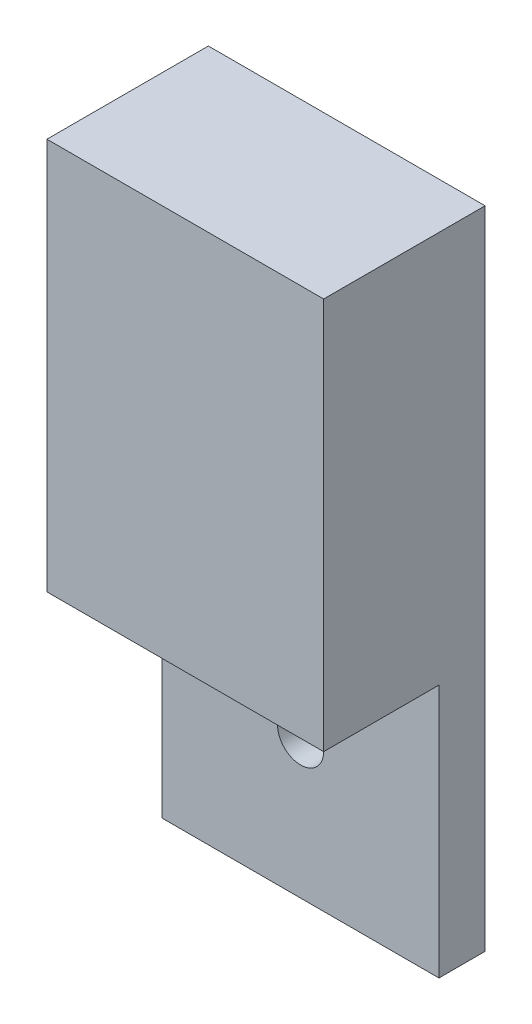
ISO-10303-21;
HEADER;
FILE_DESCRIPTION(('STEP AP214'),'2;1');
FILE_NAME('part.step','',(''),(''),'','','');
FILE_SCHEMA(('AUTOMOTIVE_DESIGN { 1 0 10303 214 1 1 1 1 }'));
ENDSEC;
DATA;
#1=APPLICATION_CONTEXT('core data for automotive mechanical design processes');
#2=APPLICATION_PROTOCOL_DEFINITION('international standard','automotive_design',2000,#1);
#3=PRODUCT_CONTEXT('',#1,'mechanical');
#4=PRODUCT('Part','Part','',(#3));
#5=PRODUCT_RELATED_PRODUCT_CATEGORY('part','',(#4));
#6=PRODUCT_DEFINITION_FORMATION('','',#4);
#7=PRODUCT_DEFINITION_CONTEXT('part definition',#1,'design');
#8=PRODUCT_DEFINITION('design','',#6,#7);
#9=PRODUCT_DEFINITION_SHAPE('','',#8);
#10=(LENGTH_UNIT() NAMED_UNIT(*) SI_UNIT(.MILLI.,.METRE.));
#11=(NAMED_UNIT(*) PLANE_ANGLE_UNIT() SI_UNIT($,.RADIAN.));
#12=(NAMED_UNIT(*) SI_UNIT($,.STERADIAN.) SOLID_ANGLE_UNIT());
#13=UNCERTAINTY_MEASURE_WITH_UNIT(LENGTH_MEASURE(1.E-05),#10,'distance_accuracy_value','');
#14=(GEOMETRIC_REPRESENTATION_CONTEXT(3) GLOBAL_UNCERTAINTY_ASSIGNED_CONTEXT((#13)) GLOBAL_UNIT_ASSIGNED_CONTEXT((#10,
#11,#12)) REPRESENTATION_CONTEXT('',''));
#15=CARTESIAN_POINT('',(0.,0.,0.));
#16=DIRECTION('',(0.,0.,1.));
#17=DIRECTION('',(1.,0.,0.));
#18=AXIS2_PLACEMENT_3D('',#15,#16,#17);
#19=CARTESIAN_POINT('',(0.,0.,0.));
#20=DIRECTION('',(0.,0.,-1.));
#21=DIRECTION('',(-1.,0.,0.));
#22=AXIS2_PLACEMENT_3D('',#19,#20,#21);
#23=PLANE('',#22);
#24=CARTESIAN_POINT('',(0.,-8.,0.));
#25=DIRECTION('',(0.,0.,1.));
#26=DIRECTION('',(1.,0.,0.));
#27=AXIS2_PLACEMENT_3D('',#24,#25,#26);
#28=CIRCLE('',#27,1.);
#29=CARTESIAN_POINT('',(1.,-8.,0.));
#30=VERTEX_POINT('',#29);
#31=EDGE_CURVE('E163',#30,#30,#28,.T.);
#32=ORIENTED_EDGE('',*,*,#31,.F.);
#33=EDGE_LOOP('',(#32));
#34=FACE_BOUND('',#33,.T.);
#35=DIRECTION('',(1.,0.,0.));
#36=VECTOR('',#35,1.);
#37=CARTESIAN_POINT('',(-6.,-3.,0.));
#38=LINE('',#37,#36);
#39=CARTESIAN_POINT('',(-6.,-3.,0.));
#40=VERTEX_POINT('',#39);
#41=CARTESIAN_POINT('',(6.,-3.,0.));
#42=VERTEX_POINT('',#41);
#43=EDGE_CURVE('E57',#40,#42,#38,.T.);
#44=ORIENTED_EDGE('',*,*,#43,.F.);
#45=DIRECTION('',(0.,-1.,0.));
#46=VECTOR('',#45,1.);
#47=CARTESIAN_POINT('',(-6.,-14.,0.));
#48=LINE('',#47,#46);
#49=CARTESIAN_POINT('',(-6.,-14.,0.));
#50=VERTEX_POINT('',#49);
#51=EDGE_CURVE('E124',#40,#50,#48,.T.);
#52=ORIENTED_EDGE('',*,*,#51,.T.);
#53=DIRECTION('',(1.,0.,0.));
#54=VECTOR('',#53,1.);
#55=CARTESIAN_POINT('',(-6.,-14.,0.));
#56=LINE('',#55,#54);
#57=CARTESIAN_POINT('',(6.,-14.,0.));
#58=VERTEX_POINT('',#57);
#59=EDGE_CURVE('E138',#50,#58,#56,.T.);
#60=ORIENTED_EDGE('',*,*,#59,.T.);
#61=DIRECTION('',(0.,1.,0.));
#62=VECTOR('',#61,1.);
#63=CARTESIAN_POINT('',(6.,-14.,0.));
#64=LINE('',#63,#62);
#65=EDGE_CURVE('E126',#58,#42,#64,.T.);
#66=ORIENTED_EDGE('',*,*,#65,.T.);
#67=EDGE_LOOP('',(#44,#52,#60,#66));
#68=FACE_BOUND('',#67,.T.);
#69=ADVANCED_FACE('F39',(#34,#68),#23,.F.);
#70=CARTESIAN_POINT('',(6.,-14.,-2.));
#71=DIRECTION('',(1.,0.,0.));
#72=DIRECTION('',(0.,0.,-1.));
#73=AXIS2_PLACEMENT_3D('',#70,#71,#72);
#74=PLANE('',#73);
#75=ORIENTED_EDGE('',*,*,#65,.F.);
#76=DIRECTION('',(0.,0.,1.));
#77=VECTOR('',#76,1.);
#78=CARTESIAN_POINT('',(6.,-14.,-2.));
#79=LINE('',#78,#77);
#80=CARTESIAN_POINT('',(6.,-14.,-2.));
#81=VERTEX_POINT('',#80);
#82=EDGE_CURVE('E11',#81,#58,#79,.T.);
#83=ORIENTED_EDGE('',*,*,#82,.F.);
#84=DIRECTION('',(0.,1.,0.));
#85=VECTOR('',#84,1.);
#86=CARTESIAN_POINT('',(6.,-14.,-2.));
#87=LINE('',#86,#85);
#88=CARTESIAN_POINT('',(6.,14.,-2.));
#89=VERTEX_POINT('',#88);
#90=EDGE_CURVE('E134',#81,#89,#87,.T.);
#91=ORIENTED_EDGE('',*,*,#90,.T.);
#92=DIRECTION('',(0.,0.,1.));
#93=VECTOR('',#92,1.);
#94=CARTESIAN_POINT('',(6.,14.,-2.));
#95=LINE('',#94,#93);
#96=CARTESIAN_POINT('',(6.,14.,5.));
#97=VERTEX_POINT('',#96);
#98=EDGE_CURVE('E43',#89,#97,#95,.T.);
#99=ORIENTED_EDGE('',*,*,#98,.T.);
#100=DIRECTION('',(0.,1.,0.));
#101=VECTOR('',#100,1.);
#102=CARTESIAN_POINT('',(6.,14.,5.));
#103=LINE('',#102,#101);
#104=CARTESIAN_POINT('',(6.,-3.,5.));
#105=VERTEX_POINT('',#104);
#106=EDGE_CURVE('E112',#105,#97,#103,.T.);
#107=ORIENTED_EDGE('',*,*,#106,.F.);
#108=DIRECTION('',(0.,0.,-1.));
#109=VECTOR('',#108,1.);
#110=CARTESIAN_POINT('',(6.,-3.,5.));
#111=LINE('',#110,#109);
#112=EDGE_CURVE('E107',#105,#42,#111,.T.);
#113=ORIENTED_EDGE('',*,*,#112,.T.);
#114=EDGE_LOOP('',(#75,#83,#91,#99,#107,#113));
#115=FACE_BOUND('',#114,.T.);
#116=ADVANCED_FACE('F41',(#115),#74,.T.);
#117=CARTESIAN_POINT('',(-6.,-14.,-2.));
#118=DIRECTION('',(0.,-1.,0.));
#119=DIRECTION('',(0.,0.,-1.));
#120=AXIS2_PLACEMENT_3D('',#117,#118,#119);
#121=PLANE('',#120);
#122=ORIENTED_EDGE('',*,*,#59,.F.);
#123=DIRECTION('',(0.,0.,1.));
#124=VECTOR('',#123,1.);
#125=CARTESIAN_POINT('',(-6.,-14.,-2.));
#126=LINE('',#125,#124);
#127=CARTESIAN_POINT('',(-6.,-14.,-2.));
#128=VERTEX_POINT('',#127);
#129=EDGE_CURVE('E49',#128,#50,#126,.T.);
#130=ORIENTED_EDGE('',*,*,#129,.F.);
#131=DIRECTION('',(1.,0.,0.));
#132=VECTOR('',#131,1.);
#133=CARTESIAN_POINT('',(-6.,-14.,-2.));
#134=LINE('',#133,#132);
#135=EDGE_CURVE('E145',#128,#81,#134,.T.);
#136=ORIENTED_EDGE('',*,*,#135,.T.);
#137=ORIENTED_EDGE('',*,*,#82,.T.);
#138=EDGE_LOOP('',(#122,#130,#136,#137));
#139=FACE_BOUND('',#138,.T.);
#140=ADVANCED_FACE('F191',(#139),#121,.T.);
#141=CARTESIAN_POINT('',(-6.,-14.,-2.));
#142=DIRECTION('',(-1.,0.,0.));
#143=DIRECTION('',(0.,0.,1.));
#144=AXIS2_PLACEMENT_3D('',#141,#142,#143);
#145=PLANE('',#144);
#146=ORIENTED_EDGE('',*,*,#51,.F.);
#147=DIRECTION('',(0.,0.,-1.));
#148=VECTOR('',#147,1.);
#149=CARTESIAN_POINT('',(-6.,-3.,5.));
#150=LINE('',#149,#148);
#151=CARTESIAN_POINT('',(-6.,-3.,5.));
#152=VERTEX_POINT('',#151);
#153=EDGE_CURVE('E105',#152,#40,#150,.T.);
#154=ORIENTED_EDGE('',*,*,#153,.F.);
#155=DIRECTION('',(0.,-1.,0.));
#156=VECTOR('',#155,1.);
#157=CARTESIAN_POINT('',(-6.,14.,5.));
#158=LINE('',#157,#156);
#159=CARTESIAN_POINT('',(-6.,14.,5.));
#160=VERTEX_POINT('',#159);
#161=EDGE_CURVE('E113',#160,#152,#158,.T.);
#162=ORIENTED_EDGE('',*,*,#161,.F.);
#163=DIRECTION('',(0.,0.,1.));
#164=VECTOR('',#163,1.);
#165=CARTESIAN_POINT('',(-6.,14.,-2.));
#166=LINE('',#165,#164);
#167=CARTESIAN_POINT('',(-6.,14.,-2.));
#168=VERTEX_POINT('',#167);
#169=EDGE_CURVE('E154',#168,#160,#166,.T.);
#170=ORIENTED_EDGE('',*,*,#169,.F.);
#171=DIRECTION('',(0.,-1.,0.));
#172=VECTOR('',#171,1.);
#173=CARTESIAN_POINT('',(-6.,-14.,-2.));
#174=LINE('',#173,#172);
#175=EDGE_CURVE('E141',#168,#128,#174,.T.);
#176=ORIENTED_EDGE('',*,*,#175,.T.);
#177=ORIENTED_EDGE('',*,*,#129,.T.);
#178=EDGE_LOOP('',(#146,#154,#162,#170,#176,#177));
#179=FACE_BOUND('',#178,.T.);
#180=ADVANCED_FACE('F122',(#179),#145,.T.);
#181=CARTESIAN_POINT('',(-6.,14.,-2.));
#182=DIRECTION('',(0.,1.,0.));
#183=DIRECTION('',(0.,0.,1.));
#184=AXIS2_PLACEMENT_3D('',#181,#182,#183);
#185=PLANE('',#184);
#186=ORIENTED_EDGE('',*,*,#169,.T.);
#187=DIRECTION('',(-1.,0.,0.));
#188=VECTOR('',#187,1.);
#189=CARTESIAN_POINT('',(-6.,14.,5.));
#190=LINE('',#189,#188);
#191=EDGE_CURVE('E118',#97,#160,#190,.T.);
#192=ORIENTED_EDGE('',*,*,#191,.F.);
#193=ORIENTED_EDGE('',*,*,#98,.F.);
#194=DIRECTION('',(-1.,0.,0.));
#195=VECTOR('',#194,1.);
#196=CARTESIAN_POINT('',(-6.,14.,-2.));
#197=LINE('',#196,#195);
#198=EDGE_CURVE('E137',#89,#168,#197,.T.);
#199=ORIENTED_EDGE('',*,*,#198,.T.);
#200=EDGE_LOOP('',(#186,#192,#193,#199));
#201=FACE_BOUND('',#200,.T.);
#202=ADVANCED_FACE('F159',(#201),#185,.T.);
#203=CARTESIAN_POINT('',(0.,0.,-2.));
#204=DIRECTION('',(0.,0.,-1.));
#205=DIRECTION('',(-1.,0.,0.));
#206=AXIS2_PLACEMENT_3D('',#203,#204,#205);
#207=PLANE('',#206);
#208=CARTESIAN_POINT('',(0.,-8.,-2.));
#209=DIRECTION('',(0.,0.,-1.));
#210=DIRECTION('',(-1.,0.,0.));
#211=AXIS2_PLACEMENT_3D('',#208,#209,#210);
#212=CIRCLE('',#211,1.);
#213=CARTESIAN_POINT('',(-0.999999999999999,-8.,-2.));
#214=VERTEX_POINT('',#213);
#215=EDGE_CURVE('E166',#214,#214,#212,.F.);
#216=ORIENTED_EDGE('',*,*,#215,.T.);
#217=EDGE_LOOP('',(#216));
#218=FACE_BOUND('',#217,.T.);
#219=ORIENTED_EDGE('',*,*,#90,.F.);
#220=ORIENTED_EDGE('',*,*,#135,.F.);
#221=ORIENTED_EDGE('',*,*,#175,.F.);
#222=ORIENTED_EDGE('',*,*,#198,.F.);
#223=EDGE_LOOP('',(#219,#220,#221,#222));
#224=FACE_BOUND('',#223,.T.);
#225=ADVANCED_FACE('F175',(#218,#224),#207,.T.);
#226=CARTESIAN_POINT('',(-6.,-3.,5.));
#227=DIRECTION('',(0.,1.,0.));
#228=DIRECTION('',(0.,0.,1.));
#229=AXIS2_PLACEMENT_3D('',#226,#227,#228);
#230=PLANE('',#229);
#231=ORIENTED_EDGE('',*,*,#43,.T.);
#232=ORIENTED_EDGE('',*,*,#112,.F.);
#233=DIRECTION('',(1.,0.,0.));
#234=VECTOR('',#233,1.);
#235=CARTESIAN_POINT('',(-6.,-3.,5.));
#236=LINE('',#235,#234);
#237=EDGE_CURVE('E101',#152,#105,#236,.T.);
#238=ORIENTED_EDGE('',*,*,#237,.F.);
#239=ORIENTED_EDGE('',*,*,#153,.T.);
#240=EDGE_LOOP('',(#231,#232,#238,#239));
#241=FACE_BOUND('',#240,.T.);
#242=ADVANCED_FACE('F103',(#241),#230,.F.);
#243=CARTESIAN_POINT('',(0.,0.,5.));
#244=DIRECTION('',(0.,0.,1.));
#245=DIRECTION('',(1.,0.,0.));
#246=AXIS2_PLACEMENT_3D('',#243,#244,#245);
#247=PLANE('',#246);
#248=ORIENTED_EDGE('',*,*,#161,.T.);
#249=ORIENTED_EDGE('',*,*,#237,.T.);
#250=ORIENTED_EDGE('',*,*,#106,.T.);
#251=ORIENTED_EDGE('',*,*,#191,.T.);
#252=EDGE_LOOP('',(#248,#249,#250,#251));
#253=FACE_BOUND('',#252,.T.);
#254=ADVANCED_FACE('F117',(#253),#247,.T.);
#255=CARTESIAN_POINT('',(0.,-8.,-2.001));
#256=DIRECTION('',(0.,0.,1.));
#257=DIRECTION('',(1.,0.,0.));
#258=AXIS2_PLACEMENT_3D('',#255,#256,#257);
#259=CYLINDRICAL_SURFACE('',#258,1.);
#260=ORIENTED_EDGE('',*,*,#215,.F.);
#261=EDGE_LOOP('',(#260));
#262=FACE_BOUND('',#261,.T.);
#263=ORIENTED_EDGE('',*,*,#31,.T.);
#264=EDGE_LOOP('',(#263));
#265=FACE_BOUND('',#264,.T.);
#266=ADVANCED_FACE('F178',(#262,#265),#259,.F.);
#267=CLOSED_SHELL('',(#69,#116,#140,#180,#202,#225,#242,#254,#266));
#268=MANIFOLD_SOLID_BREP('B2',#267);
#269=ADVANCED_BREP_SHAPE_REPRESENTATION('',(#18,#268),#14);
#270=SHAPE_DEFINITION_REPRESENTATION(#9,#269);
ENDSEC;
END-ISO-10303-21;
